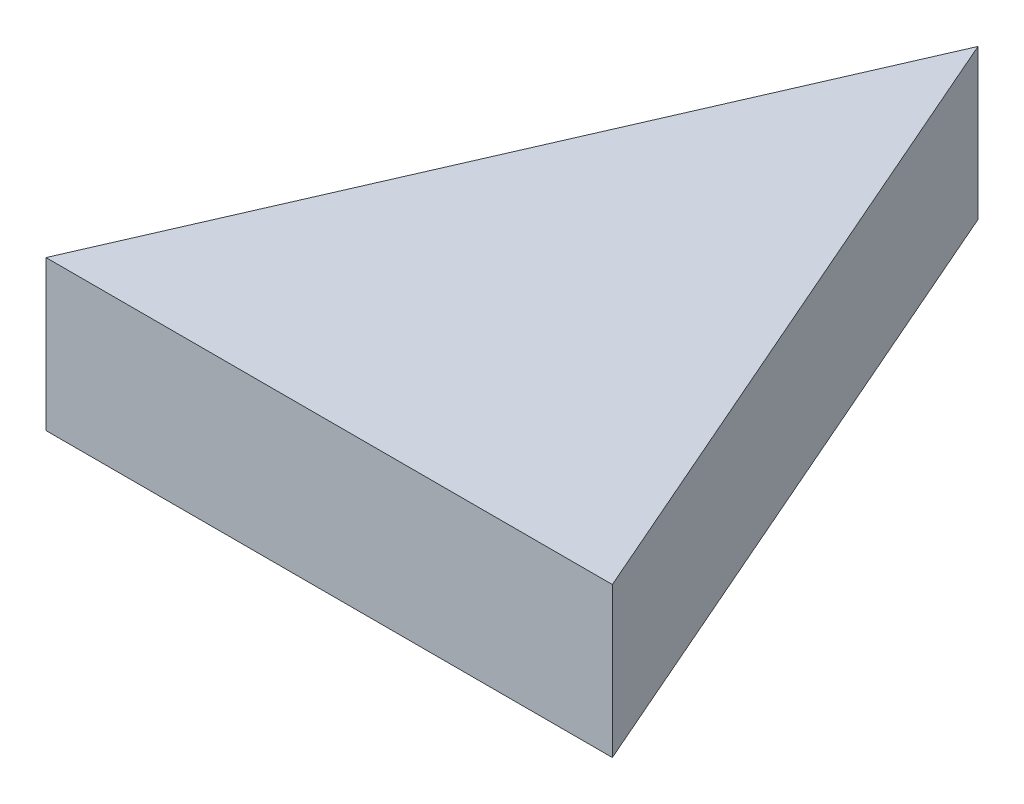
ISO-10303-21;
HEADER;
FILE_DESCRIPTION(('STEP AP214'),'2;1');
FILE_NAME('part.step','',(''),(''),'','','');
FILE_SCHEMA(('AUTOMOTIVE_DESIGN { 1 0 10303 214 1 1 1 1 }'));
ENDSEC;
DATA;
#1=APPLICATION_CONTEXT('core data for automotive mechanical design processes');
#2=APPLICATION_PROTOCOL_DEFINITION('international standard','automotive_design',2000,#1);
#3=PRODUCT_CONTEXT('',#1,'mechanical');
#4=PRODUCT('Part','Part','',(#3));
#5=PRODUCT_RELATED_PRODUCT_CATEGORY('part','',(#4));
#6=PRODUCT_DEFINITION_FORMATION('','',#4);
#7=PRODUCT_DEFINITION_CONTEXT('part definition',#1,'design');
#8=PRODUCT_DEFINITION('design','',#6,#7);
#9=PRODUCT_DEFINITION_SHAPE('','',#8);
#10=(LENGTH_UNIT() NAMED_UNIT(*) SI_UNIT(.MILLI.,.METRE.));
#11=(NAMED_UNIT(*) PLANE_ANGLE_UNIT() SI_UNIT($,.RADIAN.));
#12=(NAMED_UNIT(*) SI_UNIT($,.STERADIAN.) SOLID_ANGLE_UNIT());
#13=UNCERTAINTY_MEASURE_WITH_UNIT(LENGTH_MEASURE(1.E-05),#10,'distance_accuracy_value','');
#14=(GEOMETRIC_REPRESENTATION_CONTEXT(3) GLOBAL_UNCERTAINTY_ASSIGNED_CONTEXT((#13)) GLOBAL_UNIT_ASSIGNED_CONTEXT((#10,
#11,#12)) REPRESENTATION_CONTEXT('',''));
#15=CARTESIAN_POINT('',(0.,0.,0.));
#16=DIRECTION('',(0.,0.,1.));
#17=DIRECTION('',(1.,0.,0.));
#18=AXIS2_PLACEMENT_3D('',#15,#16,#17);
#19=CARTESIAN_POINT('',(6.,3.175,-13.7477270848675));
#20=DIRECTION('',(0.916515138991168,0.,0.4));
#21=DIRECTION('',(0.4,0.,-0.916515138991168));
#22=AXIS2_PLACEMENT_3D('',#19,#20,#21);
#23=PLANE('',#22);
#24=DIRECTION('',(-0.4,0.,0.916515138991168));
#25=VECTOR('',#24,1.);
#26=CARTESIAN_POINT('',(6.,0.,-13.7477270848675));
#27=LINE('',#26,#25);
#28=CARTESIAN_POINT('',(6.,0.,-13.7477270848675));
#29=VERTEX_POINT('',#28);
#30=CARTESIAN_POINT('',(0.,0.,0.));
#31=VERTEX_POINT('',#30);
#32=EDGE_CURVE('E80',#29,#31,#27,.T.);
#33=ORIENTED_EDGE('',*,*,#32,.T.);
#34=DIRECTION('',(0.,-1.,0.));
#35=VECTOR('',#34,1.);
#36=CARTESIAN_POINT('',(0.,3.175,0.));
#37=LINE('',#36,#35);
#38=CARTESIAN_POINT('',(0.,3.175,0.));
#39=VERTEX_POINT('',#38);
#40=EDGE_CURVE('E11',#39,#31,#37,.T.);
#41=ORIENTED_EDGE('',*,*,#40,.F.);
#42=DIRECTION('',(-0.4,0.,0.916515138991168));
#43=VECTOR('',#42,1.);
#44=CARTESIAN_POINT('',(6.,3.175,-13.7477270848675));
#45=LINE('',#44,#43);
#46=CARTESIAN_POINT('',(6.,3.175,-13.7477270848675));
#47=VERTEX_POINT('',#46);
#48=EDGE_CURVE('E73',#47,#39,#45,.T.);
#49=ORIENTED_EDGE('',*,*,#48,.F.);
#50=DIRECTION('',(0.,-1.,0.));
#51=VECTOR('',#50,1.);
#52=CARTESIAN_POINT('',(6.,3.175,-13.7477270848675));
#53=LINE('',#52,#51);
#54=EDGE_CURVE('E81',#47,#29,#53,.T.);
#55=ORIENTED_EDGE('',*,*,#54,.T.);
#56=EDGE_LOOP('',(#33,#41,#49,#55));
#57=FACE_BOUND('',#56,.T.);
#58=ADVANCED_FACE('F33',(#57),#23,.F.);
#59=CARTESIAN_POINT('',(0.,3.175,0.));
#60=DIRECTION('',(0.,0.,-1.));
#61=DIRECTION('',(-1.,0.,0.));
#62=AXIS2_PLACEMENT_3D('',#59,#60,#61);
#63=PLANE('',#62);
#64=DIRECTION('',(1.,0.,0.));
#65=VECTOR('',#64,1.);
#66=CARTESIAN_POINT('',(0.,0.,0.));
#67=LINE('',#66,#65);
#68=CARTESIAN_POINT('',(12.,0.,0.));
#69=VERTEX_POINT('',#68);
#70=EDGE_CURVE('E61',#31,#69,#67,.T.);
#71=ORIENTED_EDGE('',*,*,#70,.T.);
#72=DIRECTION('',(0.,-1.,0.));
#73=VECTOR('',#72,1.);
#74=CARTESIAN_POINT('',(12.,3.175,0.));
#75=LINE('',#74,#73);
#76=CARTESIAN_POINT('',(12.,3.175,0.));
#77=VERTEX_POINT('',#76);
#78=EDGE_CURVE('E41',#77,#69,#75,.T.);
#79=ORIENTED_EDGE('',*,*,#78,.F.);
#80=DIRECTION('',(1.,0.,0.));
#81=VECTOR('',#80,1.);
#82=CARTESIAN_POINT('',(0.,3.175,0.));
#83=LINE('',#82,#81);
#84=EDGE_CURVE('E69',#39,#77,#83,.T.);
#85=ORIENTED_EDGE('',*,*,#84,.F.);
#86=ORIENTED_EDGE('',*,*,#40,.T.);
#87=EDGE_LOOP('',(#71,#79,#85,#86));
#88=FACE_BOUND('',#87,.T.);
#89=ADVANCED_FACE('F70',(#88),#63,.F.);
#90=CARTESIAN_POINT('',(12.,3.175,0.));
#91=DIRECTION('',(-0.916515138991168,0.,0.4));
#92=DIRECTION('',(0.4,0.,0.916515138991168));
#93=AXIS2_PLACEMENT_3D('',#90,#91,#92);
#94=PLANE('',#93);
#95=DIRECTION('',(-0.4,0.,-0.916515138991168));
#96=VECTOR('',#95,1.);
#97=CARTESIAN_POINT('',(12.,0.,0.));
#98=LINE('',#97,#96);
#99=EDGE_CURVE('E66',#69,#29,#98,.T.);
#100=ORIENTED_EDGE('',*,*,#99,.T.);
#101=ORIENTED_EDGE('',*,*,#54,.F.);
#102=DIRECTION('',(-0.4,0.,-0.916515138991168));
#103=VECTOR('',#102,1.);
#104=CARTESIAN_POINT('',(12.,3.175,0.));
#105=LINE('',#104,#103);
#106=EDGE_CURVE('E49',#77,#47,#105,.T.);
#107=ORIENTED_EDGE('',*,*,#106,.F.);
#108=ORIENTED_EDGE('',*,*,#78,.T.);
#109=EDGE_LOOP('',(#100,#101,#107,#108));
#110=FACE_BOUND('',#109,.T.);
#111=ADVANCED_FACE('F88',(#110),#94,.F.);
#112=CARTESIAN_POINT('',(0.,3.175,0.));
#113=DIRECTION('',(0.,1.,0.));
#114=DIRECTION('',(0.,0.,1.));
#115=AXIS2_PLACEMENT_3D('',#112,#113,#114);
#116=PLANE('',#115);
#117=ORIENTED_EDGE('',*,*,#48,.T.);
#118=ORIENTED_EDGE('',*,*,#84,.T.);
#119=ORIENTED_EDGE('',*,*,#106,.T.);
#120=EDGE_LOOP('',(#117,#118,#119));
#121=FACE_BOUND('',#120,.T.);
#122=ADVANCED_FACE('F76',(#121),#116,.T.);
#123=CARTESIAN_POINT('',(0.,0.,0.));
#124=DIRECTION('',(0.,1.,0.));
#125=DIRECTION('',(0.,0.,1.));
#126=AXIS2_PLACEMENT_3D('',#123,#124,#125);
#127=PLANE('',#126);
#128=ORIENTED_EDGE('',*,*,#32,.F.);
#129=ORIENTED_EDGE('',*,*,#99,.F.);
#130=ORIENTED_EDGE('',*,*,#70,.F.);
#131=EDGE_LOOP('',(#128,#129,#130));
#132=FACE_BOUND('',#131,.T.);
#133=ADVANCED_FACE('F89',(#132),#127,.F.);
#134=CLOSED_SHELL('',(#58,#89,#111,#122,#133));
#135=MANIFOLD_SOLID_BREP('B2',#134);
#136=ADVANCED_BREP_SHAPE_REPRESENTATION('',(#18,#135),#14);
#137=SHAPE_DEFINITION_REPRESENTATION(#9,#136);
ENDSEC;
END-ISO-10303-21;
